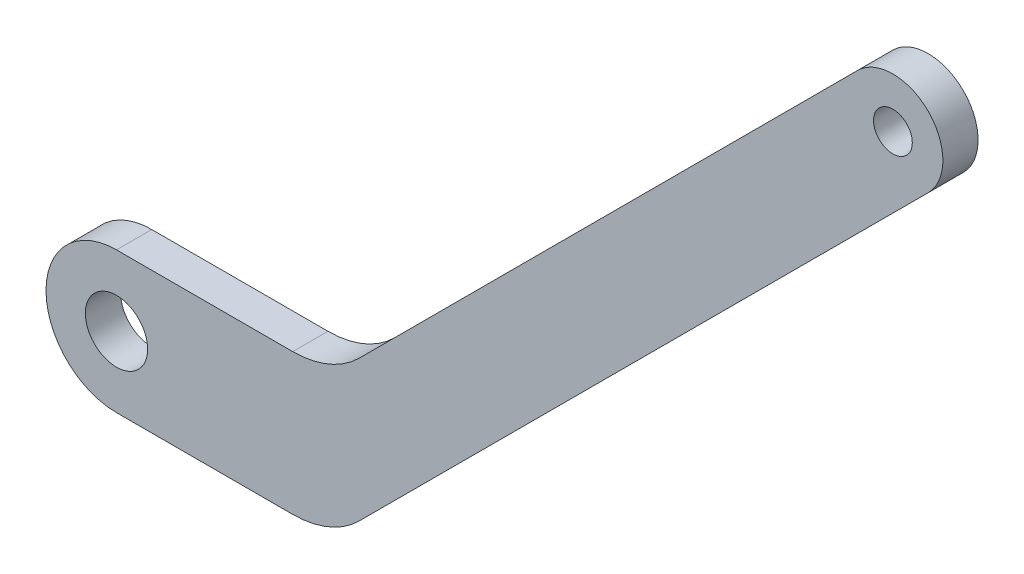
ISO-10303-21;
HEADER;
FILE_DESCRIPTION(('STEP AP214'),'2;1');
FILE_NAME('part.step','',(''),(''),'','','');
FILE_SCHEMA(('AUTOMOTIVE_DESIGN { 1 0 10303 214 1 1 1 1 }'));
ENDSEC;
DATA;
#1=APPLICATION_CONTEXT('core data for automotive mechanical design processes');
#2=APPLICATION_PROTOCOL_DEFINITION('international standard','automotive_design',2000,#1);
#3=PRODUCT_CONTEXT('',#1,'mechanical');
#4=PRODUCT('Part','Part','',(#3));
#5=PRODUCT_RELATED_PRODUCT_CATEGORY('part','',(#4));
#6=PRODUCT_DEFINITION_FORMATION('','',#4);
#7=PRODUCT_DEFINITION_CONTEXT('part definition',#1,'design');
#8=PRODUCT_DEFINITION('design','',#6,#7);
#9=PRODUCT_DEFINITION_SHAPE('','',#8);
#10=(LENGTH_UNIT() NAMED_UNIT(*) SI_UNIT(.MILLI.,.METRE.));
#11=(NAMED_UNIT(*) PLANE_ANGLE_UNIT() SI_UNIT($,.RADIAN.));
#12=(NAMED_UNIT(*) SI_UNIT($,.STERADIAN.) SOLID_ANGLE_UNIT());
#13=UNCERTAINTY_MEASURE_WITH_UNIT(LENGTH_MEASURE(1.E-05),#10,'distance_accuracy_value','');
#14=(GEOMETRIC_REPRESENTATION_CONTEXT(3) GLOBAL_UNCERTAINTY_ASSIGNED_CONTEXT((#13)) GLOBAL_UNIT_ASSIGNED_CONTEXT((#10,
#11,#12)) REPRESENTATION_CONTEXT('',''));
#15=CARTESIAN_POINT('',(0.,0.,0.));
#16=DIRECTION('',(0.,0.,1.));
#17=DIRECTION('',(1.,0.,0.));
#18=AXIS2_PLACEMENT_3D('',#15,#16,#17);
#19=CARTESIAN_POINT('',(66.088464940728,47.7643488016577,3.));
#20=DIRECTION('',(0.,0.,-1.));
#21=DIRECTION('',(-1.,0.,0.));
#22=AXIS2_PLACEMENT_3D('',#19,#20,#21);
#23=CYLINDRICAL_SURFACE('',#22,4.25);
#24=CARTESIAN_POINT('',(66.088464940728,47.7643488016577,0.));
#25=DIRECTION('',(0.,0.,1.));
#26=DIRECTION('',(1.,0.,0.));
#27=AXIS2_PLACEMENT_3D('',#24,#25,#26);
#28=CIRCLE('',#27,4.25);
#29=CARTESIAN_POINT('',(63.0832611206852,50.7695526217005,0.));
#30=VERTEX_POINT('',#29);
#31=CARTESIAN_POINT('',(69.0936687607709,44.7591449816149,0.));
#32=VERTEX_POINT('',#31);
#33=EDGE_CURVE('E132',#30,#32,#28,.F.);
#34=ORIENTED_EDGE('',*,*,#33,.F.);
#35=DIRECTION('',(0.,0.,-1.));
#36=VECTOR('',#35,1.);
#37=CARTESIAN_POINT('',(63.0832611206852,50.7695526217005,3.));
#38=LINE('',#37,#36);
#39=CARTESIAN_POINT('',(63.0832611206852,50.7695526217005,3.));
#40=VERTEX_POINT('',#39);
#41=EDGE_CURVE('E11',#40,#30,#38,.T.);
#42=ORIENTED_EDGE('',*,*,#41,.F.);
#43=CARTESIAN_POINT('',(66.088464940728,47.7643488016577,3.));
#44=DIRECTION('',(0.,0.,1.));
#45=DIRECTION('',(1.,0.,0.));
#46=AXIS2_PLACEMENT_3D('',#43,#44,#45);
#47=CIRCLE('',#46,4.25);
#48=CARTESIAN_POINT('',(69.0936687607709,44.7591449816149,3.));
#49=VERTEX_POINT('',#48);
#50=EDGE_CURVE('E150',#40,#49,#47,.F.);
#51=ORIENTED_EDGE('',*,*,#50,.T.);
#52=DIRECTION('',(0.,0.,-1.));
#53=VECTOR('',#52,1.);
#54=CARTESIAN_POINT('',(69.0936687607709,44.7591449816149,3.));
#55=LINE('',#54,#53);
#56=EDGE_CURVE('E89',#49,#32,#55,.T.);
#57=ORIENTED_EDGE('',*,*,#56,.T.);
#58=EDGE_LOOP('',(#34,#42,#51,#57));
#59=FACE_BOUND('',#58,.T.);
#60=ADVANCED_FACE('F36',(#59),#23,.T.);
#61=CARTESIAN_POINT('',(6.15685424949239,-6.15685424949238,3.));
#62=DIRECTION('',(0.707106781186548,-0.707106781186547,0.));
#63=DIRECTION('',(0.707106781186547,0.707106781186548,0.));
#64=AXIS2_PLACEMENT_3D('',#61,#62,#63);
#65=PLANE('',#64);
#66=DIRECTION('',(-0.707106781186547,-0.707106781186548,0.));
#67=VECTOR('',#66,1.);
#68=CARTESIAN_POINT('',(6.15685424949239,-6.15685424949238,0.));
#69=LINE('',#68,#67);
#70=CARTESIAN_POINT('',(20.6568542494924,8.34314575050763,0.));
#71=VERTEX_POINT('',#70);
#72=EDGE_CURVE('E135',#30,#71,#69,.T.);
#73=ORIENTED_EDGE('',*,*,#72,.T.);
#74=DIRECTION('',(0.,0.,-1.));
#75=VECTOR('',#74,1.);
#76=CARTESIAN_POINT('',(20.6568542494924,8.34314575050763,3.));
#77=LINE('',#76,#75);
#78=CARTESIAN_POINT('',(20.6568542494924,8.34314575050763,3.));
#79=VERTEX_POINT('',#78);
#80=EDGE_CURVE('E45',#79,#71,#77,.T.);
#81=ORIENTED_EDGE('',*,*,#80,.F.);
#82=DIRECTION('',(-0.707106781186547,-0.707106781186548,0.));
#83=VECTOR('',#82,1.);
#84=CARTESIAN_POINT('',(6.15685424949239,-6.15685424949238,3.));
#85=LINE('',#84,#83);
#86=EDGE_CURVE('E173',#40,#79,#85,.T.);
#87=ORIENTED_EDGE('',*,*,#86,.F.);
#88=ORIENTED_EDGE('',*,*,#41,.T.);
#89=EDGE_LOOP('',(#73,#81,#87,#88));
#90=FACE_BOUND('',#89,.T.);
#91=ADVANCED_FACE('F203',(#90),#65,.F.);
#92=CARTESIAN_POINT('',(14.9997500117588,13.9997500007108,3.));
#93=DIRECTION('',(0.,0.,-1.));
#94=DIRECTION('',(-1.,0.,0.));
#95=AXIS2_PLACEMENT_3D('',#92,#93,#94);
#96=CYLINDRICAL_SURFACE('',#95,8.00000000000001);
#97=CARTESIAN_POINT('',(14.9997500117588,13.9997500007108,0.));
#98=DIRECTION('',(0.,0.,1.));
#99=DIRECTION('',(1.,0.,0.));
#100=AXIS2_PLACEMENT_3D('',#97,#98,#99);
#101=CIRCLE('',#100,8.00000000000001);
#102=CARTESIAN_POINT('',(14.9997500117588,5.99975000071084,0.));
#103=VERTEX_POINT('',#102);
#104=EDGE_CURVE('E138',#103,#71,#101,.T.);
#105=ORIENTED_EDGE('',*,*,#104,.F.);
#106=DIRECTION('',(0.,0.,-1.));
#107=VECTOR('',#106,1.);
#108=CARTESIAN_POINT('',(14.9997500117588,5.99975000071084,3.));
#109=LINE('',#108,#107);
#110=CARTESIAN_POINT('',(14.9997500117588,5.99975000071084,3.));
#111=VERTEX_POINT('',#110);
#112=EDGE_CURVE('E156',#111,#103,#109,.T.);
#113=ORIENTED_EDGE('',*,*,#112,.F.);
#114=CARTESIAN_POINT('',(14.9997500117588,13.9997500007108,3.));
#115=DIRECTION('',(0.,0.,1.));
#116=DIRECTION('',(1.,0.,0.));
#117=AXIS2_PLACEMENT_3D('',#114,#115,#116);
#118=CIRCLE('',#117,8.00000000000001);
#119=EDGE_CURVE('E175',#111,#79,#118,.T.);
#120=ORIENTED_EDGE('',*,*,#119,.T.);
#121=ORIENTED_EDGE('',*,*,#80,.T.);
#122=EDGE_LOOP('',(#105,#113,#120,#121));
#123=FACE_BOUND('',#122,.T.);
#124=ADVANCED_FACE('F187',(#123),#96,.F.);
#125=CARTESIAN_POINT('',(0.,5.99975000071084,3.));
#126=DIRECTION('',(0.,1.,0.));
#127=DIRECTION('',(-1.,0.,0.));
#128=AXIS2_PLACEMENT_3D('',#125,#126,#127);
#129=PLANE('',#128);
#130=DIRECTION('',(1.,0.,0.));
#131=VECTOR('',#130,1.);
#132=CARTESIAN_POINT('',(0.,5.99975000071084,0.));
#133=LINE('',#132,#131);
#134=CARTESIAN_POINT('',(0.000249999289151017,5.99975000071084,0.));
#135=VERTEX_POINT('',#134);
#136=EDGE_CURVE('E141',#135,#103,#133,.T.);
#137=ORIENTED_EDGE('',*,*,#136,.F.);
#138=DIRECTION('',(0.,0.,-1.));
#139=VECTOR('',#138,1.);
#140=CARTESIAN_POINT('',(0.000249999289151017,5.99975000071084,3.));
#141=LINE('',#140,#139);
#142=CARTESIAN_POINT('',(0.000249999289151017,5.99975000071084,3.));
#143=VERTEX_POINT('',#142);
#144=EDGE_CURVE('E154',#143,#135,#141,.T.);
#145=ORIENTED_EDGE('',*,*,#144,.F.);
#146=DIRECTION('',(1.,0.,0.));
#147=VECTOR('',#146,1.);
#148=CARTESIAN_POINT('',(0.,5.99975000071084,3.));
#149=LINE('',#148,#147);
#150=EDGE_CURVE('E178',#143,#111,#149,.T.);
#151=ORIENTED_EDGE('',*,*,#150,.T.);
#152=ORIENTED_EDGE('',*,*,#112,.T.);
#153=EDGE_LOOP('',(#137,#145,#151,#152));
#154=FACE_BOUND('',#153,.T.);
#155=ADVANCED_FACE('F182',(#154),#129,.T.);
#156=CARTESIAN_POINT('',(0.000249999289151017,-0.000249999289158823,3.));
#157=DIRECTION('',(0.,0.,-1.));
#158=DIRECTION('',(-1.,0.,0.));
#159=AXIS2_PLACEMENT_3D('',#156,#157,#158);
#160=CYLINDRICAL_SURFACE('',#159,6.);
#161=CARTESIAN_POINT('',(0.000249999289151017,-0.000249999289158823,0.));
#162=DIRECTION('',(0.,0.,1.));
#163=DIRECTION('',(1.,0.,0.));
#164=AXIS2_PLACEMENT_3D('',#161,#162,#163);
#165=CIRCLE('',#164,6.);
#166=CARTESIAN_POINT('',(0.000249999289151017,-6.00024999928916,0.));
#167=VERTEX_POINT('',#166);
#168=EDGE_CURVE('E144',#135,#167,#165,.T.);
#169=ORIENTED_EDGE('',*,*,#168,.T.);
#170=DIRECTION('',(0.,0.,-1.));
#171=VECTOR('',#170,1.);
#172=CARTESIAN_POINT('',(0.000249999289151017,-6.00024999928916,3.));
#173=LINE('',#172,#171);
#174=CARTESIAN_POINT('',(0.000249999289151017,-6.00024999928916,3.));
#175=VERTEX_POINT('',#174);
#176=EDGE_CURVE('E124',#175,#167,#173,.T.);
#177=ORIENTED_EDGE('',*,*,#176,.F.);
#178=CARTESIAN_POINT('',(0.000249999289151017,-0.000249999289158823,3.));
#179=DIRECTION('',(0.,0.,1.));
#180=DIRECTION('',(1.,0.,0.));
#181=AXIS2_PLACEMENT_3D('',#178,#179,#180);
#182=CIRCLE('',#181,6.);
#183=EDGE_CURVE('E115',#143,#175,#182,.T.);
#184=ORIENTED_EDGE('',*,*,#183,.F.);
#185=ORIENTED_EDGE('',*,*,#144,.T.);
#186=EDGE_LOOP('',(#169,#177,#184,#185));
#187=FACE_BOUND('',#186,.T.);
#188=ADVANCED_FACE('F193',(#187),#160,.T.);
#189=CARTESIAN_POINT('',(0.,-6.00024999928916,3.));
#190=DIRECTION('',(0.,1.,0.));
#191=DIRECTION('',(0.,0.,1.));
#192=AXIS2_PLACEMENT_3D('',#189,#190,#191);
#193=PLANE('',#192);
#194=DIRECTION('',(1.,0.,0.));
#195=VECTOR('',#194,1.);
#196=CARTESIAN_POINT('',(0.,-6.00024999928916,0.));
#197=LINE('',#196,#195);
#198=CARTESIAN_POINT('',(15.0002499992891,-6.00024999928916,0.));
#199=VERTEX_POINT('',#198);
#200=EDGE_CURVE('E123',#167,#199,#197,.T.);
#201=ORIENTED_EDGE('',*,*,#200,.T.);
#202=DIRECTION('',(0.,0.,-1.));
#203=VECTOR('',#202,1.);
#204=CARTESIAN_POINT('',(15.0002499992891,-6.00024999928916,3.));
#205=LINE('',#204,#203);
#206=CARTESIAN_POINT('',(15.0002499992891,-6.00024999928916,3.));
#207=VERTEX_POINT('',#206);
#208=EDGE_CURVE('E120',#207,#199,#205,.T.);
#209=ORIENTED_EDGE('',*,*,#208,.F.);
#210=DIRECTION('',(1.,0.,0.));
#211=VECTOR('',#210,1.);
#212=CARTESIAN_POINT('',(0.,-6.00024999928916,3.));
#213=LINE('',#212,#211);
#214=EDGE_CURVE('E108',#175,#207,#213,.T.);
#215=ORIENTED_EDGE('',*,*,#214,.F.);
#216=ORIENTED_EDGE('',*,*,#176,.T.);
#217=EDGE_LOOP('',(#201,#209,#215,#216));
#218=FACE_BOUND('',#217,.T.);
#219=ADVANCED_FACE('F121',(#218),#193,.F.);
#220=CARTESIAN_POINT('',(15.0002499992891,1.99975000071085,3.));
#221=DIRECTION('',(0.,0.,-1.));
#222=DIRECTION('',(-1.,0.,0.));
#223=AXIS2_PLACEMENT_3D('',#220,#221,#222);
#224=CYLINDRICAL_SURFACE('',#223,8.);
#225=CARTESIAN_POINT('',(15.0002499992891,1.99975000071085,0.));
#226=DIRECTION('',(0.,0.,1.));
#227=DIRECTION('',(1.,0.,0.));
#228=AXIS2_PLACEMENT_3D('',#225,#226,#227);
#229=CIRCLE('',#228,8.);
#230=CARTESIAN_POINT('',(20.6559175901351,-3.65829065855051,0.));
#231=VERTEX_POINT('',#230);
#232=EDGE_CURVE('E82',#199,#231,#229,.T.);
#233=ORIENTED_EDGE('',*,*,#232,.T.);
#234=DIRECTION('',(0.,0.,-1.));
#235=VECTOR('',#234,1.);
#236=CARTESIAN_POINT('',(20.6559175901351,-3.65829065855051,3.));
#237=LINE('',#236,#235);
#238=CARTESIAN_POINT('',(20.6559175901351,-3.65829065855051,3.));
#239=VERTEX_POINT('',#238);
#240=EDGE_CURVE('E125',#239,#231,#237,.T.);
#241=ORIENTED_EDGE('',*,*,#240,.F.);
#242=CARTESIAN_POINT('',(15.0002499992891,1.99975000071085,3.));
#243=DIRECTION('',(0.,0.,1.));
#244=DIRECTION('',(1.,0.,0.));
#245=AXIS2_PLACEMENT_3D('',#242,#243,#244);
#246=CIRCLE('',#245,8.);
#247=EDGE_CURVE('E112',#207,#239,#246,.T.);
#248=ORIENTED_EDGE('',*,*,#247,.F.);
#249=ORIENTED_EDGE('',*,*,#208,.T.);
#250=EDGE_LOOP('',(#233,#241,#248,#249));
#251=FACE_BOUND('',#250,.T.);
#252=ADVANCED_FACE('F127',(#251),#224,.T.);
#253=CARTESIAN_POINT('',(12.1527713518056,-12.1578705478583,3.));
#254=DIRECTION('',(-0.706958448855745,0.707255082407669,0.));
#255=DIRECTION('',(-0.707255082407669,-0.706958448855745,0.));
#256=AXIS2_PLACEMENT_3D('',#253,#254,#255);
#257=PLANE('',#256);
#258=DIRECTION('',(0.707255082407669,0.706958448855745,0.));
#259=VECTOR('',#258,1.);
#260=CARTESIAN_POINT('',(12.1527713518056,-12.1578705478583,0.));
#261=LINE('',#260,#259);
#262=EDGE_CURVE('E148',#231,#32,#261,.T.);
#263=ORIENTED_EDGE('',*,*,#262,.T.);
#264=ORIENTED_EDGE('',*,*,#56,.F.);
#265=DIRECTION('',(0.707255082407669,0.706958448855745,0.));
#266=VECTOR('',#265,1.);
#267=CARTESIAN_POINT('',(12.1527713518056,-12.1578705478583,3.));
#268=LINE('',#267,#266);
#269=EDGE_CURVE('E54',#239,#49,#268,.T.);
#270=ORIENTED_EDGE('',*,*,#269,.F.);
#271=ORIENTED_EDGE('',*,*,#240,.T.);
#272=EDGE_LOOP('',(#263,#264,#270,#271));
#273=FACE_BOUND('',#272,.T.);
#274=ADVANCED_FACE('F210',(#273),#257,.F.);
#275=CARTESIAN_POINT('',(0.,0.,3.));
#276=DIRECTION('',(0.,0.,1.));
#277=DIRECTION('',(1.,0.,0.));
#278=AXIS2_PLACEMENT_3D('',#275,#276,#277);
#279=PLANE('',#278);
#280=CARTESIAN_POINT('',(0.,0.,3.));
#281=DIRECTION('',(0.,0.,1.));
#282=DIRECTION('',(1.,0.,0.));
#283=AXIS2_PLACEMENT_3D('',#280,#281,#282);
#284=CIRCLE('',#283,2.65);
#285=CARTESIAN_POINT('',(2.65,0.,3.));
#286=VERTEX_POINT('',#285);
#287=EDGE_CURVE('E160',#286,#286,#284,.T.);
#288=ORIENTED_EDGE('',*,*,#287,.F.);
#289=EDGE_LOOP('',(#288));
#290=FACE_BOUND('',#289,.T.);
#291=CARTESIAN_POINT('',(66.088464940728,47.7643488016577,3.));
#292=DIRECTION('',(0.,0.,1.));
#293=DIRECTION('',(1.,0.,0.));
#294=AXIS2_PLACEMENT_3D('',#291,#292,#293);
#295=CIRCLE('',#294,1.65);
#296=CARTESIAN_POINT('',(67.738464940728,47.7643488016577,3.));
#297=VERTEX_POINT('',#296);
#298=EDGE_CURVE('E165',#297,#297,#295,.T.);
#299=ORIENTED_EDGE('',*,*,#298,.F.);
#300=EDGE_LOOP('',(#299));
#301=FACE_BOUND('',#300,.T.);
#302=ORIENTED_EDGE('',*,*,#50,.F.);
#303=ORIENTED_EDGE('',*,*,#86,.T.);
#304=ORIENTED_EDGE('',*,*,#119,.F.);
#305=ORIENTED_EDGE('',*,*,#150,.F.);
#306=ORIENTED_EDGE('',*,*,#183,.T.);
#307=ORIENTED_EDGE('',*,*,#214,.T.);
#308=ORIENTED_EDGE('',*,*,#247,.T.);
#309=ORIENTED_EDGE('',*,*,#269,.T.);
#310=EDGE_LOOP('',(#302,#303,#304,#305,#306,#307,#308,#309));
#311=FACE_BOUND('',#310,.T.);
#312=ADVANCED_FACE('F110',(#290,#301,#311),#279,.T.);
#313=CARTESIAN_POINT('',(0.,0.,0.));
#314=DIRECTION('',(0.,0.,1.));
#315=DIRECTION('',(1.,0.,0.));
#316=AXIS2_PLACEMENT_3D('',#313,#314,#315);
#317=PLANE('',#316);
#318=CARTESIAN_POINT('',(0.,0.,0.));
#319=DIRECTION('',(0.,0.,1.));
#320=DIRECTION('',(1.,0.,0.));
#321=AXIS2_PLACEMENT_3D('',#318,#319,#320);
#322=CIRCLE('',#321,2.65);
#323=CARTESIAN_POINT('',(2.65,0.,0.));
#324=VERTEX_POINT('',#323);
#325=EDGE_CURVE('E39',#324,#324,#322,.T.);
#326=ORIENTED_EDGE('',*,*,#325,.T.);
#327=EDGE_LOOP('',(#326));
#328=FACE_BOUND('',#327,.T.);
#329=CARTESIAN_POINT('',(66.088464940728,47.7643488016577,0.));
#330=DIRECTION('',(0.,0.,1.));
#331=DIRECTION('',(1.,0.,0.));
#332=AXIS2_PLACEMENT_3D('',#329,#330,#331);
#333=CIRCLE('',#332,1.65);
#334=CARTESIAN_POINT('',(67.738464940728,47.7643488016577,0.));
#335=VERTEX_POINT('',#334);
#336=EDGE_CURVE('E158',#335,#335,#333,.T.);
#337=ORIENTED_EDGE('',*,*,#336,.T.);
#338=EDGE_LOOP('',(#337));
#339=FACE_BOUND('',#338,.T.);
#340=ORIENTED_EDGE('',*,*,#33,.T.);
#341=ORIENTED_EDGE('',*,*,#262,.F.);
#342=ORIENTED_EDGE('',*,*,#232,.F.);
#343=ORIENTED_EDGE('',*,*,#200,.F.);
#344=ORIENTED_EDGE('',*,*,#168,.F.);
#345=ORIENTED_EDGE('',*,*,#136,.T.);
#346=ORIENTED_EDGE('',*,*,#104,.T.);
#347=ORIENTED_EDGE('',*,*,#72,.F.);
#348=EDGE_LOOP('',(#340,#341,#342,#343,#344,#345,#346,#347));
#349=FACE_BOUND('',#348,.T.);
#350=ADVANCED_FACE('F191',(#328,#339,#349),#317,.F.);
#351=CARTESIAN_POINT('',(66.088464940728,47.7643488016577,-3.));
#352=DIRECTION('',(0.,0.,1.));
#353=DIRECTION('',(1.,0.,0.));
#354=AXIS2_PLACEMENT_3D('',#351,#352,#353);
#355=CYLINDRICAL_SURFACE('',#354,1.65);
#356=ORIENTED_EDGE('',*,*,#298,.T.);
#357=EDGE_LOOP('',(#356));
#358=FACE_BOUND('',#357,.T.);
#359=ORIENTED_EDGE('',*,*,#336,.F.);
#360=EDGE_LOOP('',(#359));
#361=FACE_BOUND('',#360,.T.);
#362=ADVANCED_FACE('F222',(#358,#361),#355,.F.);
#363=CARTESIAN_POINT('',(0.,0.,-3.));
#364=DIRECTION('',(0.,0.,1.));
#365=DIRECTION('',(1.,0.,0.));
#366=AXIS2_PLACEMENT_3D('',#363,#364,#365);
#367=CYLINDRICAL_SURFACE('',#366,2.65);
#368=ORIENTED_EDGE('',*,*,#287,.T.);
#369=EDGE_LOOP('',(#368));
#370=FACE_BOUND('',#369,.T.);
#371=ORIENTED_EDGE('',*,*,#325,.F.);
#372=EDGE_LOOP('',(#371));
#373=FACE_BOUND('',#372,.T.);
#374=ADVANCED_FACE('F227',(#370,#373),#367,.F.);
#375=CLOSED_SHELL('',(#60,#91,#124,#155,#188,#219,#252,#274,#312,#350,#362,#374));
#376=MANIFOLD_SOLID_BREP('B2',#375);
#377=ADVANCED_BREP_SHAPE_REPRESENTATION('',(#18,#376),#14);
#378=SHAPE_DEFINITION_REPRESENTATION(#9,#377);
ENDSEC;
END-ISO-10303-21;
